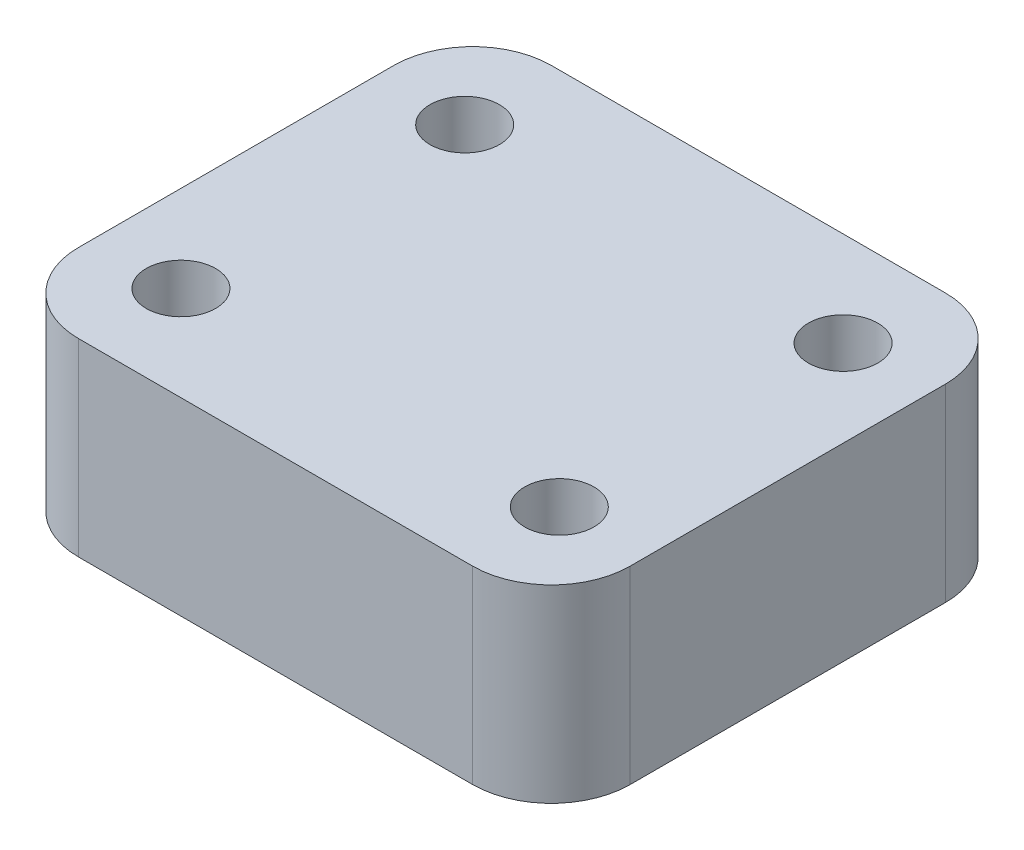
ISO-10303-21;
HEADER;
FILE_DESCRIPTION(('STEP AP214'),'2;1');
FILE_NAME('part.step','',(''),(''),'','','');
FILE_SCHEMA(('AUTOMOTIVE_DESIGN { 1 0 10303 214 1 1 1 1 }'));
ENDSEC;
DATA;
#1=APPLICATION_CONTEXT('core data for automotive mechanical design processes');
#2=APPLICATION_PROTOCOL_DEFINITION('international standard','automotive_design',2000,#1);
#3=PRODUCT_CONTEXT('',#1,'mechanical');
#4=PRODUCT('Part','Part','',(#3));
#5=PRODUCT_RELATED_PRODUCT_CATEGORY('part','',(#4));
#6=PRODUCT_DEFINITION_FORMATION('','',#4);
#7=PRODUCT_DEFINITION_CONTEXT('part definition',#1,'design');
#8=PRODUCT_DEFINITION('design','',#6,#7);
#9=PRODUCT_DEFINITION_SHAPE('','',#8);
#10=(LENGTH_UNIT() NAMED_UNIT(*) SI_UNIT(.MILLI.,.METRE.));
#11=(NAMED_UNIT(*) PLANE_ANGLE_UNIT() SI_UNIT($,.RADIAN.));
#12=(NAMED_UNIT(*) SI_UNIT($,.STERADIAN.) SOLID_ANGLE_UNIT());
#13=UNCERTAINTY_MEASURE_WITH_UNIT(LENGTH_MEASURE(1.E-05),#10,'distance_accuracy_value','');
#14=(GEOMETRIC_REPRESENTATION_CONTEXT(3) GLOBAL_UNCERTAINTY_ASSIGNED_CONTEXT((#13)) GLOBAL_UNIT_ASSIGNED_CONTEXT((#10,
#11,#12)) REPRESENTATION_CONTEXT('',''));
#15=CARTESIAN_POINT('',(0.,0.,0.));
#16=DIRECTION('',(0.,0.,1.));
#17=DIRECTION('',(1.,0.,0.));
#18=AXIS2_PLACEMENT_3D('',#15,#16,#17);
#19=CARTESIAN_POINT('',(17.5,12.,-15.));
#20=DIRECTION('',(-1.,0.,0.));
#21=DIRECTION('',(0.,0.,1.));
#22=AXIS2_PLACEMENT_3D('',#19,#20,#21);
#23=PLANE('',#22);
#24=DIRECTION('',(0.,0.,-1.));
#25=VECTOR('',#24,1.);
#26=CARTESIAN_POINT('',(17.5,0.,-15.));
#27=LINE('',#26,#25);
#28=CARTESIAN_POINT('',(17.5,0.,10.));
#29=VERTEX_POINT('',#28);
#30=CARTESIAN_POINT('',(17.5,0.,-10.));
#31=VERTEX_POINT('',#30);
#32=EDGE_CURVE('E140',#29,#31,#27,.T.);
#33=ORIENTED_EDGE('',*,*,#32,.T.);
#34=DIRECTION('',(0.,-1.,0.));
#35=VECTOR('',#34,1.);
#36=CARTESIAN_POINT('',(17.5,12.,-10.));
#37=LINE('',#36,#35);
#38=CARTESIAN_POINT('',(17.5,12.,-10.));
#39=VERTEX_POINT('',#38);
#40=EDGE_CURVE('E174',#31,#39,#37,.F.);
#41=ORIENTED_EDGE('',*,*,#40,.T.);
#42=DIRECTION('',(0.,0.,-1.));
#43=VECTOR('',#42,1.);
#44=CARTESIAN_POINT('',(17.5,12.,-15.));
#45=LINE('',#44,#43);
#46=CARTESIAN_POINT('',(17.5,12.,10.));
#47=VERTEX_POINT('',#46);
#48=EDGE_CURVE('E138',#47,#39,#45,.T.);
#49=ORIENTED_EDGE('',*,*,#48,.F.);
#50=DIRECTION('',(0.,-1.,0.));
#51=VECTOR('',#50,1.);
#52=CARTESIAN_POINT('',(17.5,12.,10.));
#53=LINE('',#52,#51);
#54=EDGE_CURVE('E170',#47,#29,#53,.T.);
#55=ORIENTED_EDGE('',*,*,#54,.T.);
#56=EDGE_LOOP('',(#33,#41,#49,#55));
#57=FACE_BOUND('',#56,.T.);
#58=ADVANCED_FACE('F39',(#57),#23,.F.);
#59=CARTESIAN_POINT('',(-17.5,12.,-15.));
#60=DIRECTION('',(0.,0.,1.));
#61=DIRECTION('',(1.,0.,0.));
#62=AXIS2_PLACEMENT_3D('',#59,#60,#61);
#63=PLANE('',#62);
#64=DIRECTION('',(-1.,0.,0.));
#65=VECTOR('',#64,1.);
#66=CARTESIAN_POINT('',(-17.5,0.,-15.));
#67=LINE('',#66,#65);
#68=CARTESIAN_POINT('',(12.5,0.,-15.));
#69=VERTEX_POINT('',#68);
#70=CARTESIAN_POINT('',(-12.5,0.,-15.));
#71=VERTEX_POINT('',#70);
#72=EDGE_CURVE('E134',#69,#71,#67,.T.);
#73=ORIENTED_EDGE('',*,*,#72,.T.);
#74=DIRECTION('',(0.,-1.,0.));
#75=VECTOR('',#74,1.);
#76=CARTESIAN_POINT('',(-12.5,12.,-15.));
#77=LINE('',#76,#75);
#78=CARTESIAN_POINT('',(-12.5,12.,-15.));
#79=VERTEX_POINT('',#78);
#80=EDGE_CURVE('E110',#71,#79,#77,.F.);
#81=ORIENTED_EDGE('',*,*,#80,.T.);
#82=DIRECTION('',(-1.,0.,0.));
#83=VECTOR('',#82,1.);
#84=CARTESIAN_POINT('',(-17.5,12.,-15.));
#85=LINE('',#84,#83);
#86=CARTESIAN_POINT('',(12.5,12.,-15.));
#87=VERTEX_POINT('',#86);
#88=EDGE_CURVE('E193',#87,#79,#85,.T.);
#89=ORIENTED_EDGE('',*,*,#88,.F.);
#90=DIRECTION('',(0.,-1.,0.));
#91=VECTOR('',#90,1.);
#92=CARTESIAN_POINT('',(12.5,12.,-15.));
#93=LINE('',#92,#91);
#94=EDGE_CURVE('E116',#87,#69,#93,.T.);
#95=ORIENTED_EDGE('',*,*,#94,.T.);
#96=EDGE_LOOP('',(#73,#81,#89,#95));
#97=FACE_BOUND('',#96,.T.);
#98=ADVANCED_FACE('F257',(#97),#63,.F.);
#99=CARTESIAN_POINT('',(-17.5,12.,-15.));
#100=DIRECTION('',(1.,0.,0.));
#101=DIRECTION('',(0.,0.,-1.));
#102=AXIS2_PLACEMENT_3D('',#99,#100,#101);
#103=PLANE('',#102);
#104=DIRECTION('',(0.,0.,1.));
#105=VECTOR('',#104,1.);
#106=CARTESIAN_POINT('',(-17.5,12.,-15.));
#107=LINE('',#106,#105);
#108=CARTESIAN_POINT('',(-17.5,12.,-10.));
#109=VERTEX_POINT('',#108);
#110=CARTESIAN_POINT('',(-17.5,12.,10.));
#111=VERTEX_POINT('',#110);
#112=EDGE_CURVE('E125',#109,#111,#107,.T.);
#113=ORIENTED_EDGE('',*,*,#112,.F.);
#114=DIRECTION('',(0.,-1.,0.));
#115=VECTOR('',#114,1.);
#116=CARTESIAN_POINT('',(-17.5,12.,-10.));
#117=LINE('',#116,#115);
#118=CARTESIAN_POINT('',(-17.5,0.,-10.));
#119=VERTEX_POINT('',#118);
#120=EDGE_CURVE('E109',#109,#119,#117,.T.);
#121=ORIENTED_EDGE('',*,*,#120,.T.);
#122=DIRECTION('',(0.,0.,1.));
#123=VECTOR('',#122,1.);
#124=CARTESIAN_POINT('',(-17.5,0.,-15.));
#125=LINE('',#124,#123);
#126=CARTESIAN_POINT('',(-17.5,0.,10.));
#127=VERTEX_POINT('',#126);
#128=EDGE_CURVE('E123',#119,#127,#125,.T.);
#129=ORIENTED_EDGE('',*,*,#128,.T.);
#130=DIRECTION('',(0.,-1.,0.));
#131=VECTOR('',#130,1.);
#132=CARTESIAN_POINT('',(-17.5,12.,10.));
#133=LINE('',#132,#131);
#134=EDGE_CURVE('E128',#127,#111,#133,.F.);
#135=ORIENTED_EDGE('',*,*,#134,.T.);
#136=EDGE_LOOP('',(#113,#121,#129,#135));
#137=FACE_BOUND('',#136,.T.);
#138=ADVANCED_FACE('F122',(#137),#103,.F.);
#139=CARTESIAN_POINT('',(-17.5,12.,15.));
#140=DIRECTION('',(0.,0.,-1.));
#141=DIRECTION('',(-1.,0.,0.));
#142=AXIS2_PLACEMENT_3D('',#139,#140,#141);
#143=PLANE('',#142);
#144=DIRECTION('',(1.,0.,0.));
#145=VECTOR('',#144,1.);
#146=CARTESIAN_POINT('',(-17.5,0.,15.));
#147=LINE('',#146,#145);
#148=CARTESIAN_POINT('',(-12.5,0.,15.));
#149=VERTEX_POINT('',#148);
#150=CARTESIAN_POINT('',(12.5,0.,15.));
#151=VERTEX_POINT('',#150);
#152=EDGE_CURVE('E133',#149,#151,#147,.T.);
#153=ORIENTED_EDGE('',*,*,#152,.T.);
#154=DIRECTION('',(0.,-1.,0.));
#155=VECTOR('',#154,1.);
#156=CARTESIAN_POINT('',(12.5,12.,15.));
#157=LINE('',#156,#155);
#158=CARTESIAN_POINT('',(12.5,12.,15.));
#159=VERTEX_POINT('',#158);
#160=EDGE_CURVE('E11',#151,#159,#157,.F.);
#161=ORIENTED_EDGE('',*,*,#160,.T.);
#162=DIRECTION('',(1.,0.,0.));
#163=VECTOR('',#162,1.);
#164=CARTESIAN_POINT('',(-17.5,12.,15.));
#165=LINE('',#164,#163);
#166=CARTESIAN_POINT('',(-12.5,12.,15.));
#167=VERTEX_POINT('',#166);
#168=EDGE_CURVE('E145',#167,#159,#165,.T.);
#169=ORIENTED_EDGE('',*,*,#168,.F.);
#170=DIRECTION('',(0.,-1.,0.));
#171=VECTOR('',#170,1.);
#172=CARTESIAN_POINT('',(-12.5,12.,15.));
#173=LINE('',#172,#171);
#174=EDGE_CURVE('E48',#167,#149,#173,.T.);
#175=ORIENTED_EDGE('',*,*,#174,.T.);
#176=EDGE_LOOP('',(#153,#161,#169,#175));
#177=FACE_BOUND('',#176,.T.);
#178=ADVANCED_FACE('F179',(#177),#143,.F.);
#179=CARTESIAN_POINT('',(0.,12.,0.));
#180=DIRECTION('',(0.,1.,0.));
#181=DIRECTION('',(0.,0.,1.));
#182=AXIS2_PLACEMENT_3D('',#179,#180,#181);
#183=PLANE('',#182);
#184=CARTESIAN_POINT('',(-12.,12.,9.));
#185=DIRECTION('',(0.,1.,0.));
#186=DIRECTION('',(0.,0.,1.));
#187=AXIS2_PLACEMENT_3D('',#184,#185,#186);
#188=CIRCLE('',#187,2.2);
#189=CARTESIAN_POINT('',(-12.,12.,11.2));
#190=VERTEX_POINT('',#189);
#191=EDGE_CURVE('E215',#190,#190,#188,.T.);
#192=ORIENTED_EDGE('',*,*,#191,.F.);
#193=EDGE_LOOP('',(#192));
#194=FACE_BOUND('',#193,.T.);
#195=CARTESIAN_POINT('',(12.,12.,9.));
#196=DIRECTION('',(0.,1.,0.));
#197=DIRECTION('',(0.,0.,1.));
#198=AXIS2_PLACEMENT_3D('',#195,#196,#197);
#199=CIRCLE('',#198,2.2);
#200=CARTESIAN_POINT('',(12.,12.,11.2));
#201=VERTEX_POINT('',#200);
#202=EDGE_CURVE('E223',#201,#201,#199,.T.);
#203=ORIENTED_EDGE('',*,*,#202,.F.);
#204=EDGE_LOOP('',(#203));
#205=FACE_BOUND('',#204,.T.);
#206=CARTESIAN_POINT('',(12.,12.,-9.));
#207=DIRECTION('',(0.,1.,0.));
#208=DIRECTION('',(0.,0.,1.));
#209=AXIS2_PLACEMENT_3D('',#206,#207,#208);
#210=CIRCLE('',#209,2.2);
#211=CARTESIAN_POINT('',(12.,12.,-6.8));
#212=VERTEX_POINT('',#211);
#213=EDGE_CURVE('E231',#212,#212,#210,.T.);
#214=ORIENTED_EDGE('',*,*,#213,.F.);
#215=EDGE_LOOP('',(#214));
#216=FACE_BOUND('',#215,.T.);
#217=CARTESIAN_POINT('',(-12.,12.,-9.));
#218=DIRECTION('',(0.,1.,0.));
#219=DIRECTION('',(0.,0.,1.));
#220=AXIS2_PLACEMENT_3D('',#217,#218,#219);
#221=CIRCLE('',#220,2.2);
#222=CARTESIAN_POINT('',(-12.,12.,-6.8));
#223=VERTEX_POINT('',#222);
#224=EDGE_CURVE('E199',#223,#223,#221,.T.);
#225=ORIENTED_EDGE('',*,*,#224,.F.);
#226=EDGE_LOOP('',(#225));
#227=FACE_BOUND('',#226,.T.);
#228=ORIENTED_EDGE('',*,*,#88,.T.);
#229=CARTESIAN_POINT('',(-12.5,12.,-10.));
#230=DIRECTION('',(0.,1.,0.));
#231=DIRECTION('',(0.,0.,1.));
#232=AXIS2_PLACEMENT_3D('',#229,#230,#231);
#233=CIRCLE('',#232,5.);
#234=EDGE_CURVE('E167',#79,#109,#233,.T.);
#235=ORIENTED_EDGE('',*,*,#234,.T.);
#236=ORIENTED_EDGE('',*,*,#112,.T.);
#237=CARTESIAN_POINT('',(-12.5,12.,10.));
#238=DIRECTION('',(0.,1.,0.));
#239=DIRECTION('',(0.,0.,1.));
#240=AXIS2_PLACEMENT_3D('',#237,#238,#239);
#241=CIRCLE('',#240,5.);
#242=EDGE_CURVE('E60',#111,#167,#241,.T.);
#243=ORIENTED_EDGE('',*,*,#242,.T.);
#244=ORIENTED_EDGE('',*,*,#168,.T.);
#245=CARTESIAN_POINT('',(12.5,12.,10.));
#246=DIRECTION('',(0.,1.,0.));
#247=DIRECTION('',(0.,0.,1.));
#248=AXIS2_PLACEMENT_3D('',#245,#246,#247);
#249=CIRCLE('',#248,5.);
#250=EDGE_CURVE('E161',#159,#47,#249,.T.);
#251=ORIENTED_EDGE('',*,*,#250,.T.);
#252=ORIENTED_EDGE('',*,*,#48,.T.);
#253=CARTESIAN_POINT('',(12.5,12.,-10.));
#254=DIRECTION('',(0.,1.,0.));
#255=DIRECTION('',(0.,0.,1.));
#256=AXIS2_PLACEMENT_3D('',#253,#254,#255);
#257=CIRCLE('',#256,5.);
#258=EDGE_CURVE('E164',#39,#87,#257,.T.);
#259=ORIENTED_EDGE('',*,*,#258,.T.);
#260=EDGE_LOOP('',(#228,#235,#236,#243,#244,#251,#252,#259));
#261=FACE_BOUND('',#260,.T.);
#262=ADVANCED_FACE('F248',(#194,#205,#216,#227,#261),#183,.T.);
#263=CARTESIAN_POINT('',(0.,0.,0.));
#264=DIRECTION('',(0.,1.,0.));
#265=DIRECTION('',(0.,0.,1.));
#266=AXIS2_PLACEMENT_3D('',#263,#264,#265);
#267=PLANE('',#266);
#268=CARTESIAN_POINT('',(-12.,0.,9.));
#269=DIRECTION('',(0.,1.,0.));
#270=DIRECTION('',(0.,0.,1.));
#271=AXIS2_PLACEMENT_3D('',#268,#269,#270);
#272=CIRCLE('',#271,2.2);
#273=CARTESIAN_POINT('',(-12.,0.,11.2));
#274=VERTEX_POINT('',#273);
#275=EDGE_CURVE('E219',#274,#274,#272,.T.);
#276=ORIENTED_EDGE('',*,*,#275,.T.);
#277=EDGE_LOOP('',(#276));
#278=FACE_BOUND('',#277,.T.);
#279=CARTESIAN_POINT('',(12.,0.,9.));
#280=DIRECTION('',(0.,1.,0.));
#281=DIRECTION('',(0.,0.,1.));
#282=AXIS2_PLACEMENT_3D('',#279,#280,#281);
#283=CIRCLE('',#282,2.2);
#284=CARTESIAN_POINT('',(12.,0.,11.2));
#285=VERTEX_POINT('',#284);
#286=EDGE_CURVE('E227',#285,#285,#283,.T.);
#287=ORIENTED_EDGE('',*,*,#286,.T.);
#288=EDGE_LOOP('',(#287));
#289=FACE_BOUND('',#288,.T.);
#290=CARTESIAN_POINT('',(12.,0.,-9.));
#291=DIRECTION('',(0.,1.,0.));
#292=DIRECTION('',(0.,0.,1.));
#293=AXIS2_PLACEMENT_3D('',#290,#291,#292);
#294=CIRCLE('',#293,2.2);
#295=CARTESIAN_POINT('',(12.,0.,-6.8));
#296=VERTEX_POINT('',#295);
#297=EDGE_CURVE('E213',#296,#296,#294,.T.);
#298=ORIENTED_EDGE('',*,*,#297,.T.);
#299=EDGE_LOOP('',(#298));
#300=FACE_BOUND('',#299,.T.);
#301=CARTESIAN_POINT('',(-12.,0.,-9.));
#302=DIRECTION('',(0.,1.,0.));
#303=DIRECTION('',(0.,0.,1.));
#304=AXIS2_PLACEMENT_3D('',#301,#302,#303);
#305=CIRCLE('',#304,2.2);
#306=CARTESIAN_POINT('',(-12.,0.,-6.8));
#307=VERTEX_POINT('',#306);
#308=EDGE_CURVE('E206',#307,#307,#305,.T.);
#309=ORIENTED_EDGE('',*,*,#308,.T.);
#310=EDGE_LOOP('',(#309));
#311=FACE_BOUND('',#310,.T.);
#312=ORIENTED_EDGE('',*,*,#128,.F.);
#313=CARTESIAN_POINT('',(-12.5,0.,-10.));
#314=DIRECTION('',(0.,1.,0.));
#315=DIRECTION('',(0.,0.,1.));
#316=AXIS2_PLACEMENT_3D('',#313,#314,#315);
#317=CIRCLE('',#316,5.);
#318=EDGE_CURVE('E105',#119,#71,#317,.F.);
#319=ORIENTED_EDGE('',*,*,#318,.T.);
#320=ORIENTED_EDGE('',*,*,#72,.F.);
#321=CARTESIAN_POINT('',(12.5,0.,-10.));
#322=DIRECTION('',(0.,1.,0.));
#323=DIRECTION('',(0.,0.,1.));
#324=AXIS2_PLACEMENT_3D('',#321,#322,#323);
#325=CIRCLE('',#324,5.);
#326=EDGE_CURVE('E117',#69,#31,#325,.F.);
#327=ORIENTED_EDGE('',*,*,#326,.T.);
#328=ORIENTED_EDGE('',*,*,#32,.F.);
#329=CARTESIAN_POINT('',(12.5,0.,10.));
#330=DIRECTION('',(0.,1.,0.));
#331=DIRECTION('',(0.,0.,1.));
#332=AXIS2_PLACEMENT_3D('',#329,#330,#331);
#333=CIRCLE('',#332,5.);
#334=EDGE_CURVE('E149',#29,#151,#333,.F.);
#335=ORIENTED_EDGE('',*,*,#334,.T.);
#336=ORIENTED_EDGE('',*,*,#152,.F.);
#337=CARTESIAN_POINT('',(-12.5,0.,10.));
#338=DIRECTION('',(0.,1.,0.));
#339=DIRECTION('',(0.,0.,1.));
#340=AXIS2_PLACEMENT_3D('',#337,#338,#339);
#341=CIRCLE('',#340,5.);
#342=EDGE_CURVE('E127',#149,#127,#341,.F.);
#343=ORIENTED_EDGE('',*,*,#342,.T.);
#344=EDGE_LOOP('',(#312,#319,#320,#327,#328,#335,#336,#343));
#345=FACE_BOUND('',#344,.T.);
#346=ADVANCED_FACE('F130',(#278,#289,#300,#311,#345),#267,.F.);
#347=CARTESIAN_POINT('',(-12.,0.,-9.));
#348=DIRECTION('',(0.,1.,0.));
#349=DIRECTION('',(0.,0.,1.));
#350=AXIS2_PLACEMENT_3D('',#347,#348,#349);
#351=CYLINDRICAL_SURFACE('',#350,2.2);
#352=ORIENTED_EDGE('',*,*,#308,.F.);
#353=EDGE_LOOP('',(#352));
#354=FACE_BOUND('',#353,.T.);
#355=ORIENTED_EDGE('',*,*,#224,.T.);
#356=EDGE_LOOP('',(#355));
#357=FACE_BOUND('',#356,.T.);
#358=ADVANCED_FACE('F244',(#354,#357),#351,.F.);
#359=CARTESIAN_POINT('',(12.,0.,-9.));
#360=DIRECTION('',(0.,1.,0.));
#361=DIRECTION('',(0.,0.,1.));
#362=AXIS2_PLACEMENT_3D('',#359,#360,#361);
#363=CYLINDRICAL_SURFACE('',#362,2.2);
#364=ORIENTED_EDGE('',*,*,#297,.F.);
#365=EDGE_LOOP('',(#364));
#366=FACE_BOUND('',#365,.T.);
#367=ORIENTED_EDGE('',*,*,#213,.T.);
#368=EDGE_LOOP('',(#367));
#369=FACE_BOUND('',#368,.T.);
#370=ADVANCED_FACE('F240',(#366,#369),#363,.F.);
#371=CARTESIAN_POINT('',(12.,0.,9.));
#372=DIRECTION('',(0.,1.,0.));
#373=DIRECTION('',(0.,0.,1.));
#374=AXIS2_PLACEMENT_3D('',#371,#372,#373);
#375=CYLINDRICAL_SURFACE('',#374,2.2);
#376=ORIENTED_EDGE('',*,*,#286,.F.);
#377=EDGE_LOOP('',(#376));
#378=FACE_BOUND('',#377,.T.);
#379=ORIENTED_EDGE('',*,*,#202,.T.);
#380=EDGE_LOOP('',(#379));
#381=FACE_BOUND('',#380,.T.);
#382=ADVANCED_FACE('F243',(#378,#381),#375,.F.);
#383=CARTESIAN_POINT('',(-12.,0.,9.));
#384=DIRECTION('',(0.,1.,0.));
#385=DIRECTION('',(0.,0.,1.));
#386=AXIS2_PLACEMENT_3D('',#383,#384,#385);
#387=CYLINDRICAL_SURFACE('',#386,2.2);
#388=ORIENTED_EDGE('',*,*,#275,.F.);
#389=EDGE_LOOP('',(#388));
#390=FACE_BOUND('',#389,.T.);
#391=ORIENTED_EDGE('',*,*,#191,.T.);
#392=EDGE_LOOP('',(#391));
#393=FACE_BOUND('',#392,.T.);
#394=ADVANCED_FACE('F266',(#390,#393),#387,.F.);
#395=CARTESIAN_POINT('',(-12.5,12.,-10.));
#396=DIRECTION('',(0.,-1.,0.));
#397=DIRECTION('',(0.,0.,-1.));
#398=AXIS2_PLACEMENT_3D('',#395,#396,#397);
#399=CYLINDRICAL_SURFACE('',#398,5.);
#400=ORIENTED_EDGE('',*,*,#234,.F.);
#401=ORIENTED_EDGE('',*,*,#80,.F.);
#402=ORIENTED_EDGE('',*,*,#318,.F.);
#403=ORIENTED_EDGE('',*,*,#120,.F.);
#404=EDGE_LOOP('',(#400,#401,#402,#403));
#405=FACE_BOUND('',#404,.T.);
#406=ADVANCED_FACE('F108',(#405),#399,.T.);
#407=CARTESIAN_POINT('',(12.5,12.,-10.));
#408=DIRECTION('',(0.,-1.,0.));
#409=DIRECTION('',(0.,0.,-1.));
#410=AXIS2_PLACEMENT_3D('',#407,#408,#409);
#411=CYLINDRICAL_SURFACE('',#410,5.);
#412=ORIENTED_EDGE('',*,*,#258,.F.);
#413=ORIENTED_EDGE('',*,*,#40,.F.);
#414=ORIENTED_EDGE('',*,*,#326,.F.);
#415=ORIENTED_EDGE('',*,*,#94,.F.);
#416=EDGE_LOOP('',(#412,#413,#414,#415));
#417=FACE_BOUND('',#416,.T.);
#418=ADVANCED_FACE('F259',(#417),#411,.T.);
#419=CARTESIAN_POINT('',(12.5,12.,10.));
#420=DIRECTION('',(0.,-1.,0.));
#421=DIRECTION('',(0.,0.,-1.));
#422=AXIS2_PLACEMENT_3D('',#419,#420,#421);
#423=CYLINDRICAL_SURFACE('',#422,5.);
#424=ORIENTED_EDGE('',*,*,#250,.F.);
#425=ORIENTED_EDGE('',*,*,#160,.F.);
#426=ORIENTED_EDGE('',*,*,#334,.F.);
#427=ORIENTED_EDGE('',*,*,#54,.F.);
#428=EDGE_LOOP('',(#424,#425,#426,#427));
#429=FACE_BOUND('',#428,.T.);
#430=ADVANCED_FACE('F186',(#429),#423,.T.);
#431=CARTESIAN_POINT('',(-12.5,12.,10.));
#432=DIRECTION('',(0.,-1.,0.));
#433=DIRECTION('',(0.,0.,-1.));
#434=AXIS2_PLACEMENT_3D('',#431,#432,#433);
#435=CYLINDRICAL_SURFACE('',#434,5.);
#436=ORIENTED_EDGE('',*,*,#242,.F.);
#437=ORIENTED_EDGE('',*,*,#134,.F.);
#438=ORIENTED_EDGE('',*,*,#342,.F.);
#439=ORIENTED_EDGE('',*,*,#174,.F.);
#440=EDGE_LOOP('',(#436,#437,#438,#439));
#441=FACE_BOUND('',#440,.T.);
#442=ADVANCED_FACE('F41',(#441),#435,.T.);
#443=CLOSED_SHELL('',(#58,#98,#138,#178,#262,#346,#358,#370,#382,#394,#406,#418,#430,#442));
#444=MANIFOLD_SOLID_BREP('B2',#443);
#445=ADVANCED_BREP_SHAPE_REPRESENTATION('',(#18,#444),#14);
#446=SHAPE_DEFINITION_REPRESENTATION(#9,#445);
ENDSEC;
END-ISO-10303-21;
